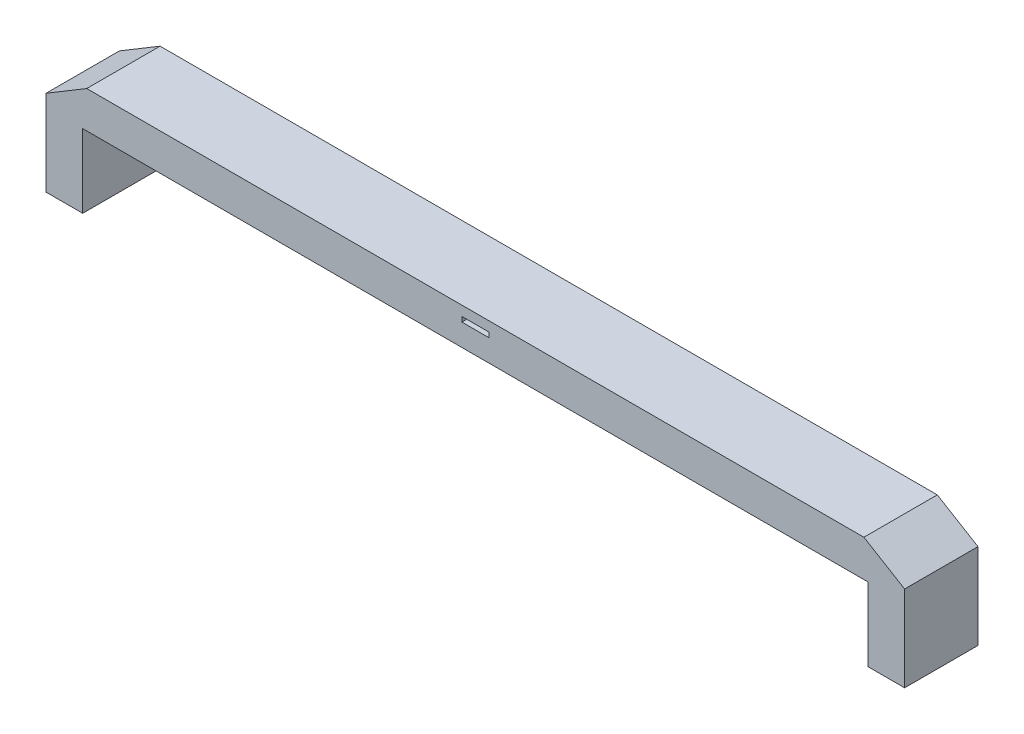
ISO-10303-21;
HEADER;
FILE_DESCRIPTION(('STEP AP214'),'2;1');
FILE_NAME('part.step','',(''),(''),'','','');
FILE_SCHEMA(('AUTOMOTIVE_DESIGN { 1 0 10303 214 1 1 1 1 }'));
ENDSEC;
DATA;
#1=APPLICATION_CONTEXT('core data for automotive mechanical design processes');
#2=APPLICATION_PROTOCOL_DEFINITION('international standard','automotive_design',2000,#1);
#3=PRODUCT_CONTEXT('',#1,'mechanical');
#4=PRODUCT('Part','Part','',(#3));
#5=PRODUCT_RELATED_PRODUCT_CATEGORY('part','',(#4));
#6=PRODUCT_DEFINITION_FORMATION('','',#4);
#7=PRODUCT_DEFINITION_CONTEXT('part definition',#1,'design');
#8=PRODUCT_DEFINITION('design','',#6,#7);
#9=PRODUCT_DEFINITION_SHAPE('','',#8);
#10=(LENGTH_UNIT() NAMED_UNIT(*) SI_UNIT(.MILLI.,.METRE.));
#11=(NAMED_UNIT(*) PLANE_ANGLE_UNIT() SI_UNIT($,.RADIAN.));
#12=(NAMED_UNIT(*) SI_UNIT($,.STERADIAN.) SOLID_ANGLE_UNIT());
#13=UNCERTAINTY_MEASURE_WITH_UNIT(LENGTH_MEASURE(1.E-05),#10,'distance_accuracy_value','');
#14=(GEOMETRIC_REPRESENTATION_CONTEXT(3) GLOBAL_UNCERTAINTY_ASSIGNED_CONTEXT((#13)) GLOBAL_UNIT_ASSIGNED_CONTEXT((#10,
#11,#12)) REPRESENTATION_CONTEXT('',''));
#15=CARTESIAN_POINT('',(0.,0.,0.));
#16=DIRECTION('',(0.,0.,1.));
#17=DIRECTION('',(1.,0.,0.));
#18=AXIS2_PLACEMENT_3D('',#15,#16,#17);
#19=CARTESIAN_POINT('',(0.,0.,0.));
#20=DIRECTION('',(0.,1.,0.));
#21=DIRECTION('',(0.,0.,1.));
#22=AXIS2_PLACEMENT_3D('',#19,#20,#21);
#23=PLANE('',#22);
#24=DIRECTION('',(0.,0.,1.));
#25=VECTOR('',#24,1.);
#26=CARTESIAN_POINT('',(-140.5,0.,0.));
#27=LINE('',#26,#25);
#28=CARTESIAN_POINT('',(-140.5,0.,0.));
#29=VERTEX_POINT('',#28);
#30=CARTESIAN_POINT('',(-140.5,0.,30.0000000000001));
#31=VERTEX_POINT('',#30);
#32=EDGE_CURVE('E216',#29,#31,#27,.T.);
#33=ORIENTED_EDGE('',*,*,#32,.F.);
#34=DIRECTION('',(-1.,0.,0.));
#35=VECTOR('',#34,1.);
#36=CARTESIAN_POINT('',(0.,0.,0.));
#37=LINE('',#36,#35);
#38=CARTESIAN_POINT('',(0.,0.,0.));
#39=VERTEX_POINT('',#38);
#40=EDGE_CURVE('E294',#39,#29,#37,.T.);
#41=ORIENTED_EDGE('',*,*,#40,.F.);
#42=DIRECTION('',(0.,0.,-1.));
#43=VECTOR('',#42,1.);
#44=CARTESIAN_POINT('',(0.,0.,30.));
#45=LINE('',#44,#43);
#46=CARTESIAN_POINT('',(0.,0.,30.));
#47=VERTEX_POINT('',#46);
#48=EDGE_CURVE('E257',#47,#39,#45,.T.);
#49=ORIENTED_EDGE('',*,*,#48,.F.);
#50=DIRECTION('',(1.,0.,0.));
#51=VECTOR('',#50,1.);
#52=CARTESIAN_POINT('',(-321.,0.,30.0000000000001));
#53=LINE('',#52,#51);
#54=EDGE_CURVE('E301',#31,#47,#53,.T.);
#55=ORIENTED_EDGE('',*,*,#54,.F.);
#56=EDGE_LOOP('',(#33,#41,#49,#55));
#57=FACE_BOUND('',#56,.T.);
#58=ADVANCED_FACE('F43',(#57),#23,.F.);
#59=DIRECTION('',(0.,0.,-1.));
#60=VECTOR('',#59,1.);
#61=CARTESIAN_POINT('',(-180.5,0.,30.0000000000001));
#62=LINE('',#61,#60);
#63=CARTESIAN_POINT('',(-180.5,0.,30.0000000000001));
#64=VERTEX_POINT('',#63);
#65=CARTESIAN_POINT('',(-180.5,0.,0.));
#66=VERTEX_POINT('',#65);
#67=EDGE_CURVE('E206',#64,#66,#62,.T.);
#68=ORIENTED_EDGE('',*,*,#67,.F.);
#69=CARTESIAN_POINT('',(-321.,0.,30.0000000000001));
#70=VERTEX_POINT('',#69);
#71=EDGE_CURVE('E290',#70,#64,#53,.T.);
#72=ORIENTED_EDGE('',*,*,#71,.F.);
#73=DIRECTION('',(0.,0.,1.));
#74=VECTOR('',#73,1.);
#75=CARTESIAN_POINT('',(-321.,0.,0.));
#76=LINE('',#75,#74);
#77=CARTESIAN_POINT('',(-321.,0.,0.));
#78=VERTEX_POINT('',#77);
#79=EDGE_CURVE('E296',#78,#70,#76,.T.);
#80=ORIENTED_EDGE('',*,*,#79,.F.);
#81=EDGE_CURVE('E295',#66,#78,#37,.T.);
#82=ORIENTED_EDGE('',*,*,#81,.F.);
#83=EDGE_LOOP('',(#68,#72,#80,#82));
#84=FACE_BOUND('',#83,.T.);
#85=ADVANCED_FACE('F340',(#84),#23,.F.);
#86=CARTESIAN_POINT('',(0.,15.,0.));
#87=DIRECTION('',(0.,0.,1.));
#88=DIRECTION('',(1.,0.,0.));
#89=AXIS2_PLACEMENT_3D('',#86,#87,#88);
#90=PLANE('',#89);
#91=DIRECTION('',(0.,1.,0.));
#92=VECTOR('',#91,1.);
#93=CARTESIAN_POINT('',(-336.,-30.,0.));
#94=LINE('',#93,#92);
#95=CARTESIAN_POINT('',(-336.,-30.,0.));
#96=VERTEX_POINT('',#95);
#97=CARTESIAN_POINT('',(-336.,4.99999999999995,0.));
#98=VERTEX_POINT('',#97);
#99=EDGE_CURVE('E256',#96,#98,#94,.T.);
#100=ORIENTED_EDGE('',*,*,#99,.T.);
#101=DIRECTION('',(-0.857167300702111,-0.515038074910056,0.));
#102=VECTOR('',#101,1.);
#103=CARTESIAN_POINT('',(-319.357205176495,15.,0.));
#104=LINE('',#103,#102);
#105=CARTESIAN_POINT('',(-319.357205176495,15.,0.));
#106=VERTEX_POINT('',#105);
#107=EDGE_CURVE('E55',#98,#106,#104,.F.);
#108=ORIENTED_EDGE('',*,*,#107,.T.);
#109=DIRECTION('',(-1.,0.,0.));
#110=VECTOR('',#109,1.);
#111=CARTESIAN_POINT('',(0.,15.,0.));
#112=LINE('',#111,#110);
#113=CARTESIAN_POINT('',(-1.64279482350521,15.,0.));
#114=VERTEX_POINT('',#113);
#115=EDGE_CURVE('E282',#114,#106,#112,.T.);
#116=ORIENTED_EDGE('',*,*,#115,.F.);
#117=DIRECTION('',(-0.857167300702111,0.515038074910056,0.));
#118=VECTOR('',#117,1.);
#119=CARTESIAN_POINT('',(-1.64279482350521,15.,0.));
#120=LINE('',#119,#118);
#121=CARTESIAN_POINT('',(15.,4.99999999999992,0.));
#122=VERTEX_POINT('',#121);
#123=EDGE_CURVE('E56',#114,#122,#120,.F.);
#124=ORIENTED_EDGE('',*,*,#123,.T.);
#125=DIRECTION('',(0.,1.,0.));
#126=VECTOR('',#125,1.);
#127=CARTESIAN_POINT('',(15.,-30.,0.));
#128=LINE('',#127,#126);
#129=CARTESIAN_POINT('',(15.,-30.,0.));
#130=VERTEX_POINT('',#129);
#131=EDGE_CURVE('E238',#130,#122,#128,.T.);
#132=ORIENTED_EDGE('',*,*,#131,.F.);
#133=DIRECTION('',(-1.,0.,0.));
#134=VECTOR('',#133,1.);
#135=CARTESIAN_POINT('',(15.,-30.,0.));
#136=LINE('',#135,#134);
#137=CARTESIAN_POINT('',(0.,-30.,0.));
#138=VERTEX_POINT('',#137);
#139=EDGE_CURVE('E243',#130,#138,#136,.T.);
#140=ORIENTED_EDGE('',*,*,#139,.T.);
#141=DIRECTION('',(0.,1.,0.));
#142=VECTOR('',#141,1.);
#143=CARTESIAN_POINT('',(0.,-30.,0.));
#144=LINE('',#143,#142);
#145=EDGE_CURVE('E263',#138,#39,#144,.T.);
#146=ORIENTED_EDGE('',*,*,#145,.T.);
#147=ORIENTED_EDGE('',*,*,#40,.T.);
#148=DIRECTION('',(0.,1.,0.));
#149=VECTOR('',#148,1.);
#150=CARTESIAN_POINT('',(-140.5,-0.0001,0.));
#151=LINE('',#150,#149);
#152=CARTESIAN_POINT('',(-140.5,-0.0001,0.));
#153=VERTEX_POINT('',#152);
#154=EDGE_CURVE('E230',#153,#29,#151,.T.);
#155=ORIENTED_EDGE('',*,*,#154,.F.);
#156=DIRECTION('',(1.,0.,0.));
#157=VECTOR('',#156,1.);
#158=CARTESIAN_POINT('',(-180.5,-0.0001,0.));
#159=LINE('',#158,#157);
#160=CARTESIAN_POINT('',(-180.5,-0.0001,0.));
#161=VERTEX_POINT('',#160);
#162=EDGE_CURVE('E218',#161,#153,#159,.T.);
#163=ORIENTED_EDGE('',*,*,#162,.F.);
#164=DIRECTION('',(0.,1.,0.));
#165=VECTOR('',#164,1.);
#166=CARTESIAN_POINT('',(-180.5,-0.0001,0.));
#167=LINE('',#166,#165);
#168=EDGE_CURVE('E235',#161,#66,#167,.T.);
#169=ORIENTED_EDGE('',*,*,#168,.T.);
#170=ORIENTED_EDGE('',*,*,#81,.T.);
#171=DIRECTION('',(0.,1.,0.));
#172=VECTOR('',#171,1.);
#173=CARTESIAN_POINT('',(-321.,-30.,0.));
#174=LINE('',#173,#172);
#175=CARTESIAN_POINT('',(-321.,-30.,0.));
#176=VERTEX_POINT('',#175);
#177=EDGE_CURVE('E255',#176,#78,#174,.T.);
#178=ORIENTED_EDGE('',*,*,#177,.F.);
#179=DIRECTION('',(-1.,0.,0.));
#180=VECTOR('',#179,1.);
#181=CARTESIAN_POINT('',(-321.,-30.,0.));
#182=LINE('',#181,#180);
#183=EDGE_CURVE('E245',#176,#96,#182,.T.);
#184=ORIENTED_EDGE('',*,*,#183,.T.);
#185=EDGE_LOOP('',(#100,#108,#116,#124,#132,#140,#146,#147,#155,#163,#169,#170,#178,#184));
#186=FACE_BOUND('',#185,.T.);
#187=ADVANCED_FACE('F314',(#186),#90,.F.);
#188=CARTESIAN_POINT('',(-321.,15.,30.0000000000001));
#189=DIRECTION('',(0.,0.,-1.));
#190=DIRECTION('',(-1.,0.,0.));
#191=AXIS2_PLACEMENT_3D('',#188,#189,#190);
#192=PLANE('',#191);
#193=DIRECTION('',(1.,0.,0.));
#194=VECTOR('',#193,1.);
#195=CARTESIAN_POINT('',(-166.,9.,30.));
#196=LINE('',#195,#194);
#197=CARTESIAN_POINT('',(-166.,9.,30.0000000000001));
#198=VERTEX_POINT('',#197);
#199=CARTESIAN_POINT('',(-155.,9.,30.));
#200=VERTEX_POINT('',#199);
#201=EDGE_CURVE('E204',#198,#200,#196,.T.);
#202=ORIENTED_EDGE('',*,*,#201,.F.);
#203=DIRECTION('',(0.,-1.,0.));
#204=VECTOR('',#203,1.);
#205=CARTESIAN_POINT('',(-166.,11.,30.));
#206=LINE('',#205,#204);
#207=CARTESIAN_POINT('',(-166.,11.,30.));
#208=VERTEX_POINT('',#207);
#209=EDGE_CURVE('E176',#208,#198,#206,.T.);
#210=ORIENTED_EDGE('',*,*,#209,.F.);
#211=DIRECTION('',(-1.,0.,0.));
#212=VECTOR('',#211,1.);
#213=CARTESIAN_POINT('',(-166.,11.,30.));
#214=LINE('',#213,#212);
#215=CARTESIAN_POINT('',(-155.,11.,30.));
#216=VERTEX_POINT('',#215);
#217=EDGE_CURVE('E194',#216,#208,#214,.T.);
#218=ORIENTED_EDGE('',*,*,#217,.F.);
#219=DIRECTION('',(0.,1.,0.));
#220=VECTOR('',#219,1.);
#221=CARTESIAN_POINT('',(-155.,11.,30.));
#222=LINE('',#221,#220);
#223=EDGE_CURVE('E196',#200,#216,#222,.T.);
#224=ORIENTED_EDGE('',*,*,#223,.F.);
#225=EDGE_LOOP('',(#202,#210,#218,#224));
#226=FACE_BOUND('',#225,.T.);
#227=DIRECTION('',(1.,0.,0.));
#228=VECTOR('',#227,1.);
#229=CARTESIAN_POINT('',(-321.,15.,30.0000000000001));
#230=LINE('',#229,#228);
#231=CARTESIAN_POINT('',(-319.357205176495,15.,30.0000000000001));
#232=VERTEX_POINT('',#231);
#233=CARTESIAN_POINT('',(-1.64279482350521,15.,30.));
#234=VERTEX_POINT('',#233);
#235=EDGE_CURVE('E289',#232,#234,#230,.T.);
#236=ORIENTED_EDGE('',*,*,#235,.F.);
#237=DIRECTION('',(0.857167300702111,0.515038074910056,0.));
#238=VECTOR('',#237,1.);
#239=CARTESIAN_POINT('',(-319.357205176495,15.,30.0000000000001));
#240=LINE('',#239,#238);
#241=CARTESIAN_POINT('',(-336.,4.99999999999995,30.0000000000001));
#242=VERTEX_POINT('',#241);
#243=EDGE_CURVE('E311',#232,#242,#240,.F.);
#244=ORIENTED_EDGE('',*,*,#243,.T.);
#245=DIRECTION('',(0.,1.,0.));
#246=VECTOR('',#245,1.);
#247=CARTESIAN_POINT('',(-336.,-30.,30.0000000000001));
#248=LINE('',#247,#246);
#249=CARTESIAN_POINT('',(-336.,-30.,30.0000000000001));
#250=VERTEX_POINT('',#249);
#251=EDGE_CURVE('E260',#250,#242,#248,.T.);
#252=ORIENTED_EDGE('',*,*,#251,.F.);
#253=DIRECTION('',(1.,0.,0.));
#254=VECTOR('',#253,1.);
#255=CARTESIAN_POINT('',(-336.,-30.,30.0000000000001));
#256=LINE('',#255,#254);
#257=CARTESIAN_POINT('',(-321.,-30.,30.0000000000001));
#258=VERTEX_POINT('',#257);
#259=EDGE_CURVE('E248',#250,#258,#256,.T.);
#260=ORIENTED_EDGE('',*,*,#259,.T.);
#261=DIRECTION('',(0.,1.,0.));
#262=VECTOR('',#261,1.);
#263=CARTESIAN_POINT('',(-321.,-30.,30.0000000000001));
#264=LINE('',#263,#262);
#265=EDGE_CURVE('E254',#258,#70,#264,.T.);
#266=ORIENTED_EDGE('',*,*,#265,.T.);
#267=ORIENTED_EDGE('',*,*,#71,.T.);
#268=DIRECTION('',(0.,1.,0.));
#269=VECTOR('',#268,1.);
#270=CARTESIAN_POINT('',(-180.5,-0.0001,30.0000000000001));
#271=LINE('',#270,#269);
#272=CARTESIAN_POINT('',(-180.5,-0.0001,30.0000000000001));
#273=VERTEX_POINT('',#272);
#274=EDGE_CURVE('E232',#273,#64,#271,.T.);
#275=ORIENTED_EDGE('',*,*,#274,.F.);
#276=DIRECTION('',(-1.,0.,0.));
#277=VECTOR('',#276,1.);
#278=CARTESIAN_POINT('',(-140.5,-0.0001,30.0000000000001));
#279=LINE('',#278,#277);
#280=CARTESIAN_POINT('',(-140.5,-0.0001,30.0000000000001));
#281=VERTEX_POINT('',#280);
#282=EDGE_CURVE('E215',#281,#273,#279,.T.);
#283=ORIENTED_EDGE('',*,*,#282,.F.);
#284=DIRECTION('',(0.,1.,0.));
#285=VECTOR('',#284,1.);
#286=CARTESIAN_POINT('',(-140.5,-0.0001,30.0000000000001));
#287=LINE('',#286,#285);
#288=EDGE_CURVE('E224',#281,#31,#287,.T.);
#289=ORIENTED_EDGE('',*,*,#288,.T.);
#290=ORIENTED_EDGE('',*,*,#54,.T.);
#291=DIRECTION('',(0.,1.,0.));
#292=VECTOR('',#291,1.);
#293=CARTESIAN_POINT('',(0.,-30.,30.));
#294=LINE('',#293,#292);
#295=CARTESIAN_POINT('',(0.,-30.,30.));
#296=VERTEX_POINT('',#295);
#297=EDGE_CURVE('E269',#296,#47,#294,.T.);
#298=ORIENTED_EDGE('',*,*,#297,.F.);
#299=DIRECTION('',(1.,0.,0.));
#300=VECTOR('',#299,1.);
#301=CARTESIAN_POINT('',(0.,-30.,30.));
#302=LINE('',#301,#300);
#303=CARTESIAN_POINT('',(15.,-30.,30.));
#304=VERTEX_POINT('',#303);
#305=EDGE_CURVE('E277',#296,#304,#302,.T.);
#306=ORIENTED_EDGE('',*,*,#305,.T.);
#307=DIRECTION('',(0.,1.,0.));
#308=VECTOR('',#307,1.);
#309=CARTESIAN_POINT('',(15.,-30.,30.));
#310=LINE('',#309,#308);
#311=CARTESIAN_POINT('',(15.,4.99999999999992,30.));
#312=VERTEX_POINT('',#311);
#313=EDGE_CURVE('E268',#304,#312,#310,.T.);
#314=ORIENTED_EDGE('',*,*,#313,.T.);
#315=DIRECTION('',(0.857167300702111,-0.515038074910056,0.));
#316=VECTOR('',#315,1.);
#317=CARTESIAN_POINT('',(-1.64279482350521,15.,30.));
#318=LINE('',#317,#316);
#319=EDGE_CURVE('E307',#312,#234,#318,.F.);
#320=ORIENTED_EDGE('',*,*,#319,.T.);
#321=EDGE_LOOP('',(#236,#244,#252,#260,#266,#267,#275,#283,#289,#290,#298,#306,#314,#320));
#322=FACE_BOUND('',#321,.T.);
#323=ADVANCED_FACE('F321',(#226,#322),#192,.F.);
#324=CARTESIAN_POINT('',(0.,15.,0.));
#325=DIRECTION('',(0.,1.,0.));
#326=DIRECTION('',(0.,0.,1.));
#327=AXIS2_PLACEMENT_3D('',#324,#325,#326);
#328=PLANE('',#327);
#329=ORIENTED_EDGE('',*,*,#115,.T.);
#330=DIRECTION('',(0.,0.,1.));
#331=VECTOR('',#330,1.);
#332=CARTESIAN_POINT('',(-319.357205176495,15.,0.));
#333=LINE('',#332,#331);
#334=EDGE_CURVE('E306',#106,#232,#333,.T.);
#335=ORIENTED_EDGE('',*,*,#334,.T.);
#336=ORIENTED_EDGE('',*,*,#235,.T.);
#337=DIRECTION('',(0.,0.,-1.));
#338=VECTOR('',#337,1.);
#339=CARTESIAN_POINT('',(-1.64279482350521,15.,0.));
#340=LINE('',#339,#338);
#341=EDGE_CURVE('E293',#234,#114,#340,.T.);
#342=ORIENTED_EDGE('',*,*,#341,.T.);
#343=EDGE_LOOP('',(#329,#335,#336,#342));
#344=FACE_BOUND('',#343,.T.);
#345=ADVANCED_FACE('F316',(#344),#328,.T.);
#346=CARTESIAN_POINT('',(-321.,-30.,30.0000000000001));
#347=DIRECTION('',(1.,0.,0.));
#348=DIRECTION('',(0.,0.,-1.));
#349=AXIS2_PLACEMENT_3D('',#346,#347,#348);
#350=PLANE('',#349);
#351=ORIENTED_EDGE('',*,*,#177,.T.);
#352=ORIENTED_EDGE('',*,*,#79,.T.);
#353=ORIENTED_EDGE('',*,*,#265,.F.);
#354=DIRECTION('',(0.,0.,-1.));
#355=VECTOR('',#354,1.);
#356=CARTESIAN_POINT('',(-321.,-30.,30.0000000000001));
#357=LINE('',#356,#355);
#358=EDGE_CURVE('E237',#258,#176,#357,.T.);
#359=ORIENTED_EDGE('',*,*,#358,.T.);
#360=EDGE_LOOP('',(#351,#352,#353,#359));
#361=FACE_BOUND('',#360,.T.);
#362=ADVANCED_FACE('F331',(#361),#350,.T.);
#363=CARTESIAN_POINT('',(-336.,-30.,0.));
#364=DIRECTION('',(-1.,0.,0.));
#365=DIRECTION('',(0.,0.,1.));
#366=AXIS2_PLACEMENT_3D('',#363,#364,#365);
#367=PLANE('',#366);
#368=ORIENTED_EDGE('',*,*,#251,.T.);
#369=DIRECTION('',(0.,0.,-1.));
#370=VECTOR('',#369,1.);
#371=CARTESIAN_POINT('',(-336.,4.99999999999996,0.));
#372=LINE('',#371,#370);
#373=EDGE_CURVE('E70',#242,#98,#372,.T.);
#374=ORIENTED_EDGE('',*,*,#373,.T.);
#375=ORIENTED_EDGE('',*,*,#99,.F.);
#376=DIRECTION('',(0.,0.,1.));
#377=VECTOR('',#376,1.);
#378=CARTESIAN_POINT('',(-336.,-30.,0.));
#379=LINE('',#378,#377);
#380=EDGE_CURVE('E246',#96,#250,#379,.T.);
#381=ORIENTED_EDGE('',*,*,#380,.T.);
#382=EDGE_LOOP('',(#368,#374,#375,#381));
#383=FACE_BOUND('',#382,.T.);
#384=ADVANCED_FACE('F323',(#383),#367,.T.);
#385=CARTESIAN_POINT('',(0.,-30.,0.));
#386=DIRECTION('',(0.,1.,0.));
#387=DIRECTION('',(0.,0.,1.));
#388=AXIS2_PLACEMENT_3D('',#385,#386,#387);
#389=PLANE('',#388);
#390=ORIENTED_EDGE('',*,*,#358,.F.);
#391=ORIENTED_EDGE('',*,*,#259,.F.);
#392=ORIENTED_EDGE('',*,*,#380,.F.);
#393=ORIENTED_EDGE('',*,*,#183,.F.);
#394=EDGE_LOOP('',(#390,#391,#392,#393));
#395=FACE_BOUND('',#394,.T.);
#396=ADVANCED_FACE('F332',(#395),#389,.F.);
#397=CARTESIAN_POINT('',(15.,-30.,30.));
#398=DIRECTION('',(1.,0.,0.));
#399=DIRECTION('',(0.,0.,-1.));
#400=AXIS2_PLACEMENT_3D('',#397,#398,#399);
#401=PLANE('',#400);
#402=ORIENTED_EDGE('',*,*,#131,.T.);
#403=DIRECTION('',(0.,0.,1.));
#404=VECTOR('',#403,1.);
#405=CARTESIAN_POINT('',(15.,4.99999999999994,30.));
#406=LINE('',#405,#404);
#407=EDGE_CURVE('E11',#122,#312,#406,.T.);
#408=ORIENTED_EDGE('',*,*,#407,.T.);
#409=ORIENTED_EDGE('',*,*,#313,.F.);
#410=DIRECTION('',(0.,0.,-1.));
#411=VECTOR('',#410,1.);
#412=CARTESIAN_POINT('',(15.,-30.,30.));
#413=LINE('',#412,#411);
#414=EDGE_CURVE('E267',#304,#130,#413,.T.);
#415=ORIENTED_EDGE('',*,*,#414,.T.);
#416=EDGE_LOOP('',(#402,#408,#409,#415));
#417=FACE_BOUND('',#416,.T.);
#418=ADVANCED_FACE('F364',(#417),#401,.T.);
#419=CARTESIAN_POINT('',(0.,-30.,0.));
#420=DIRECTION('',(-1.,0.,0.));
#421=DIRECTION('',(0.,0.,1.));
#422=AXIS2_PLACEMENT_3D('',#419,#420,#421);
#423=PLANE('',#422);
#424=ORIENTED_EDGE('',*,*,#297,.T.);
#425=ORIENTED_EDGE('',*,*,#48,.T.);
#426=ORIENTED_EDGE('',*,*,#145,.F.);
#427=DIRECTION('',(0.,0.,1.));
#428=VECTOR('',#427,1.);
#429=CARTESIAN_POINT('',(0.,-30.,0.));
#430=LINE('',#429,#428);
#431=EDGE_CURVE('E276',#138,#296,#430,.T.);
#432=ORIENTED_EDGE('',*,*,#431,.T.);
#433=EDGE_LOOP('',(#424,#425,#426,#432));
#434=FACE_BOUND('',#433,.T.);
#435=ADVANCED_FACE('F353',(#434),#423,.T.);
#436=CARTESIAN_POINT('',(0.,-30.,0.));
#437=DIRECTION('',(0.,1.,0.));
#438=DIRECTION('',(0.,0.,1.));
#439=AXIS2_PLACEMENT_3D('',#436,#437,#438);
#440=PLANE('',#439);
#441=ORIENTED_EDGE('',*,*,#139,.F.);
#442=ORIENTED_EDGE('',*,*,#414,.F.);
#443=ORIENTED_EDGE('',*,*,#305,.F.);
#444=ORIENTED_EDGE('',*,*,#431,.F.);
#445=EDGE_LOOP('',(#441,#442,#443,#444));
#446=FACE_BOUND('',#445,.T.);
#447=ADVANCED_FACE('F356',(#446),#440,.F.);
#448=CARTESIAN_POINT('',(-180.5,-0.0001,30.0000000000001));
#449=DIRECTION('',(1.,0.,0.));
#450=DIRECTION('',(0.,0.,-1.));
#451=AXIS2_PLACEMENT_3D('',#448,#449,#450);
#452=PLANE('',#451);
#453=ORIENTED_EDGE('',*,*,#67,.T.);
#454=ORIENTED_EDGE('',*,*,#168,.F.);
#455=DIRECTION('',(0.,0.,-1.));
#456=VECTOR('',#455,1.);
#457=CARTESIAN_POINT('',(-180.5,-0.0001,30.0000000000001));
#458=LINE('',#457,#456);
#459=EDGE_CURVE('E213',#273,#161,#458,.T.);
#460=ORIENTED_EDGE('',*,*,#459,.F.);
#461=ORIENTED_EDGE('',*,*,#274,.T.);
#462=EDGE_LOOP('',(#453,#454,#460,#461));
#463=FACE_BOUND('',#462,.T.);
#464=ADVANCED_FACE('F338',(#463),#452,.F.);
#465=CARTESIAN_POINT('',(-140.5,-0.0001,0.));
#466=DIRECTION('',(-1.,0.,0.));
#467=DIRECTION('',(0.,0.,1.));
#468=AXIS2_PLACEMENT_3D('',#465,#466,#467);
#469=PLANE('',#468);
#470=ORIENTED_EDGE('',*,*,#32,.T.);
#471=ORIENTED_EDGE('',*,*,#288,.F.);
#472=DIRECTION('',(0.,0.,1.));
#473=VECTOR('',#472,1.);
#474=CARTESIAN_POINT('',(-140.5,-0.0001,0.));
#475=LINE('',#474,#473);
#476=EDGE_CURVE('E219',#153,#281,#475,.T.);
#477=ORIENTED_EDGE('',*,*,#476,.F.);
#478=ORIENTED_EDGE('',*,*,#154,.T.);
#479=EDGE_LOOP('',(#470,#471,#477,#478));
#480=FACE_BOUND('',#479,.T.);
#481=ADVANCED_FACE('F349',(#480),#469,.F.);
#482=CARTESIAN_POINT('',(0.,-0.0001,0.));
#483=DIRECTION('',(0.,-1.,0.));
#484=DIRECTION('',(0.,0.,-1.));
#485=AXIS2_PLACEMENT_3D('',#482,#483,#484);
#486=PLANE('',#485);
#487=ORIENTED_EDGE('',*,*,#282,.T.);
#488=ORIENTED_EDGE('',*,*,#459,.T.);
#489=ORIENTED_EDGE('',*,*,#162,.T.);
#490=ORIENTED_EDGE('',*,*,#476,.T.);
#491=EDGE_LOOP('',(#487,#488,#489,#490));
#492=FACE_BOUND('',#491,.T.);
#493=ADVANCED_FACE('F343',(#492),#486,.T.);
#494=CARTESIAN_POINT('',(-166.,11.,22.8));
#495=DIRECTION('',(-1.,0.,0.));
#496=DIRECTION('',(0.,0.,1.));
#497=AXIS2_PLACEMENT_3D('',#494,#495,#496);
#498=PLANE('',#497);
#499=ORIENTED_EDGE('',*,*,#209,.T.);
#500=DIRECTION('',(0.,0.,1.));
#501=VECTOR('',#500,1.);
#502=CARTESIAN_POINT('',(-166.,9.,22.8));
#503=LINE('',#502,#501);
#504=CARTESIAN_POINT('',(-166.,9.,22.8));
#505=VERTEX_POINT('',#504);
#506=EDGE_CURVE('E169',#505,#198,#503,.T.);
#507=ORIENTED_EDGE('',*,*,#506,.F.);
#508=DIRECTION('',(0.,-1.,0.));
#509=VECTOR('',#508,1.);
#510=CARTESIAN_POINT('',(-166.,11.,22.8));
#511=LINE('',#510,#509);
#512=CARTESIAN_POINT('',(-166.,11.,22.8));
#513=VERTEX_POINT('',#512);
#514=EDGE_CURVE('E173',#513,#505,#511,.T.);
#515=ORIENTED_EDGE('',*,*,#514,.F.);
#516=DIRECTION('',(0.,0.,1.));
#517=VECTOR('',#516,1.);
#518=CARTESIAN_POINT('',(-166.,11.,22.8));
#519=LINE('',#518,#517);
#520=EDGE_CURVE('E207',#513,#208,#519,.T.);
#521=ORIENTED_EDGE('',*,*,#520,.T.);
#522=EDGE_LOOP('',(#499,#507,#515,#521));
#523=FACE_BOUND('',#522,.T.);
#524=ADVANCED_FACE('F171',(#523),#498,.F.);
#525=CARTESIAN_POINT('',(-166.,11.,22.8));
#526=DIRECTION('',(0.,1.,0.));
#527=DIRECTION('',(0.,0.,1.));
#528=AXIS2_PLACEMENT_3D('',#525,#526,#527);
#529=PLANE('',#528);
#530=ORIENTED_EDGE('',*,*,#217,.T.);
#531=ORIENTED_EDGE('',*,*,#520,.F.);
#532=DIRECTION('',(-1.,0.,0.));
#533=VECTOR('',#532,1.);
#534=CARTESIAN_POINT('',(-166.,11.,22.8));
#535=LINE('',#534,#533);
#536=CARTESIAN_POINT('',(-155.,11.,22.8));
#537=VERTEX_POINT('',#536);
#538=EDGE_CURVE('E181',#537,#513,#535,.T.);
#539=ORIENTED_EDGE('',*,*,#538,.F.);
#540=DIRECTION('',(0.,0.,1.));
#541=VECTOR('',#540,1.);
#542=CARTESIAN_POINT('',(-155.,11.,22.8));
#543=LINE('',#542,#541);
#544=EDGE_CURVE('E209',#537,#216,#543,.T.);
#545=ORIENTED_EDGE('',*,*,#544,.T.);
#546=EDGE_LOOP('',(#530,#531,#539,#545));
#547=FACE_BOUND('',#546,.T.);
#548=ADVANCED_FACE('F405',(#547),#529,.F.);
#549=CARTESIAN_POINT('',(-155.,11.,22.8));
#550=DIRECTION('',(1.,0.,0.));
#551=DIRECTION('',(0.,0.,-1.));
#552=AXIS2_PLACEMENT_3D('',#549,#550,#551);
#553=PLANE('',#552);
#554=ORIENTED_EDGE('',*,*,#223,.T.);
#555=ORIENTED_EDGE('',*,*,#544,.F.);
#556=DIRECTION('',(0.,1.,0.));
#557=VECTOR('',#556,1.);
#558=CARTESIAN_POINT('',(-155.,11.,22.8));
#559=LINE('',#558,#557);
#560=CARTESIAN_POINT('',(-155.,9.,22.8));
#561=VERTEX_POINT('',#560);
#562=EDGE_CURVE('E186',#561,#537,#559,.T.);
#563=ORIENTED_EDGE('',*,*,#562,.F.);
#564=DIRECTION('',(0.,0.,1.));
#565=VECTOR('',#564,1.);
#566=CARTESIAN_POINT('',(-155.,9.,22.8));
#567=LINE('',#566,#565);
#568=EDGE_CURVE('E179',#561,#200,#567,.T.);
#569=ORIENTED_EDGE('',*,*,#568,.T.);
#570=EDGE_LOOP('',(#554,#555,#563,#569));
#571=FACE_BOUND('',#570,.T.);
#572=ADVANCED_FACE('F396',(#571),#553,.F.);
#573=CARTESIAN_POINT('',(-166.,9.,22.8));
#574=DIRECTION('',(0.,-1.,0.));
#575=DIRECTION('',(0.,0.,-1.));
#576=AXIS2_PLACEMENT_3D('',#573,#574,#575);
#577=PLANE('',#576);
#578=ORIENTED_EDGE('',*,*,#201,.T.);
#579=ORIENTED_EDGE('',*,*,#568,.F.);
#580=DIRECTION('',(1.,0.,0.));
#581=VECTOR('',#580,1.);
#582=CARTESIAN_POINT('',(-166.,9.,22.8));
#583=LINE('',#582,#581);
#584=EDGE_CURVE('E183',#505,#561,#583,.T.);
#585=ORIENTED_EDGE('',*,*,#584,.F.);
#586=ORIENTED_EDGE('',*,*,#506,.T.);
#587=EDGE_LOOP('',(#578,#579,#585,#586));
#588=FACE_BOUND('',#587,.T.);
#589=ADVANCED_FACE('F184',(#588),#577,.F.);
#590=CARTESIAN_POINT('',(0.,0.,22.8));
#591=DIRECTION('',(0.,0.,1.));
#592=DIRECTION('',(1.,0.,0.));
#593=AXIS2_PLACEMENT_3D('',#590,#591,#592);
#594=PLANE('',#593);
#595=ORIENTED_EDGE('',*,*,#514,.T.);
#596=ORIENTED_EDGE('',*,*,#584,.T.);
#597=ORIENTED_EDGE('',*,*,#562,.T.);
#598=ORIENTED_EDGE('',*,*,#538,.T.);
#599=EDGE_LOOP('',(#595,#596,#597,#598));
#600=FACE_BOUND('',#599,.T.);
#601=ADVANCED_FACE('F192',(#600),#594,.T.);
#602=CARTESIAN_POINT('',(-319.357205176495,15.,0.));
#603=DIRECTION('',(0.515038074910056,-0.857167300702111,0.));
#604=DIRECTION('',(0.,0.,1.));
#605=AXIS2_PLACEMENT_3D('',#602,#603,#604);
#606=PLANE('',#605);
#607=ORIENTED_EDGE('',*,*,#107,.F.);
#608=ORIENTED_EDGE('',*,*,#373,.F.);
#609=ORIENTED_EDGE('',*,*,#243,.F.);
#610=ORIENTED_EDGE('',*,*,#334,.F.);
#611=EDGE_LOOP('',(#607,#608,#609,#610));
#612=FACE_BOUND('',#611,.T.);
#613=ADVANCED_FACE('F325',(#612),#606,.F.);
#614=CARTESIAN_POINT('',(-1.64279482350521,15.,0.));
#615=DIRECTION('',(-0.515038074910056,-0.857167300702111,0.));
#616=DIRECTION('',(0.,0.,-1.));
#617=AXIS2_PLACEMENT_3D('',#614,#615,#616);
#618=PLANE('',#617);
#619=ORIENTED_EDGE('',*,*,#319,.F.);
#620=ORIENTED_EDGE('',*,*,#407,.F.);
#621=ORIENTED_EDGE('',*,*,#123,.F.);
#622=ORIENTED_EDGE('',*,*,#341,.F.);
#623=EDGE_LOOP('',(#619,#620,#621,#622));
#624=FACE_BOUND('',#623,.T.);
#625=ADVANCED_FACE('F46',(#624),#618,.F.);
#626=CLOSED_SHELL('',(#58,#85,#187,#323,#345,#362,#384,#396,#418,#435,#447,#464,#481,#493,#524,
#548,#572,#589,#601,#613,#625));
#627=MANIFOLD_SOLID_BREP('B2',#626);
#628=ADVANCED_BREP_SHAPE_REPRESENTATION('',(#18,#627),#14);
#629=SHAPE_DEFINITION_REPRESENTATION(#9,#628);
ENDSEC;
END-ISO-10303-21;
